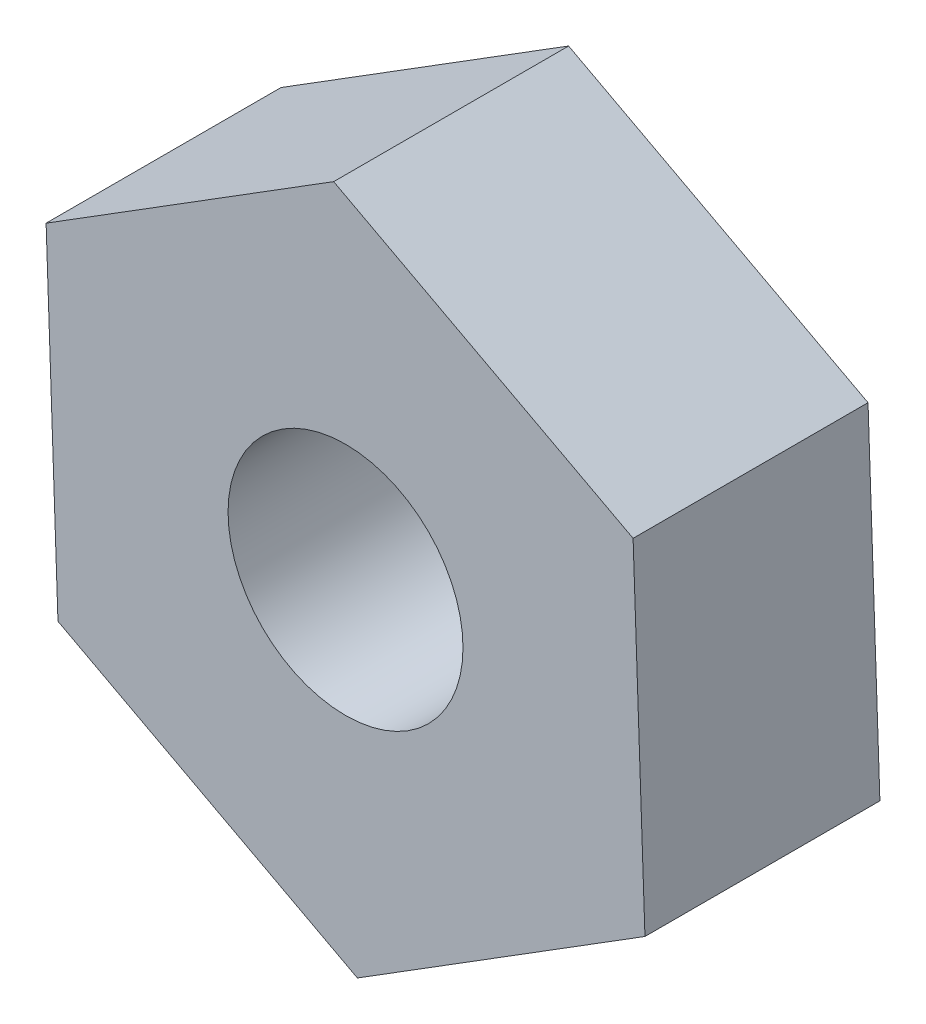
ISO-10303-21;
HEADER;
FILE_DESCRIPTION(('STEP AP214'),'2;1');
FILE_NAME('part.step','',(''),(''),'','','');
FILE_SCHEMA(('AUTOMOTIVE_DESIGN { 1 0 10303 214 1 1 1 1 }'));
ENDSEC;
DATA;
#1=APPLICATION_CONTEXT('core data for automotive mechanical design processes');
#2=APPLICATION_PROTOCOL_DEFINITION('international standard','automotive_design',2000,#1);
#3=PRODUCT_CONTEXT('',#1,'mechanical');
#4=PRODUCT('Part','Part','',(#3));
#5=PRODUCT_RELATED_PRODUCT_CATEGORY('part','',(#4));
#6=PRODUCT_DEFINITION_FORMATION('','',#4);
#7=PRODUCT_DEFINITION_CONTEXT('part definition',#1,'design');
#8=PRODUCT_DEFINITION('design','',#6,#7);
#9=PRODUCT_DEFINITION_SHAPE('','',#8);
#10=(LENGTH_UNIT() NAMED_UNIT(*) SI_UNIT(.MILLI.,.METRE.));
#11=(NAMED_UNIT(*) PLANE_ANGLE_UNIT() SI_UNIT($,.RADIAN.));
#12=(NAMED_UNIT(*) SI_UNIT($,.STERADIAN.) SOLID_ANGLE_UNIT());
#13=UNCERTAINTY_MEASURE_WITH_UNIT(LENGTH_MEASURE(1.E-05),#10,'distance_accuracy_value','');
#14=(GEOMETRIC_REPRESENTATION_CONTEXT(3) GLOBAL_UNCERTAINTY_ASSIGNED_CONTEXT((#13)) GLOBAL_UNIT_ASSIGNED_CONTEXT((#10,
#11,#12)) REPRESENTATION_CONTEXT('',''));
#15=CARTESIAN_POINT('',(0.,0.,0.));
#16=DIRECTION('',(0.,0.,1.));
#17=DIRECTION('',(1.,0.,0.));
#18=AXIS2_PLACEMENT_3D('',#15,#16,#17);
#19=CARTESIAN_POINT('',(0.,0.,2.));
#20=DIRECTION('',(0.,0.,1.));
#21=DIRECTION('',(1.,0.,0.));
#22=AXIS2_PLACEMENT_3D('',#19,#20,#21);
#23=PLANE('',#22);
#24=DIRECTION('',(-0.0349970512423811,0.999387415572329,0.));
#25=VECTOR('',#24,1.);
#26=CARTESIAN_POINT('',(2.5489824313199,-1.35499885540757,2.));
#27=LINE('',#26,#25);
#28=CARTESIAN_POINT('',(2.5489824313199,-1.35499885540757,2.));
#29=VERTEX_POINT('',#28);
#30=CARTESIAN_POINT('',(2.44795464654174,1.52998411161947,2.));
#31=VERTEX_POINT('',#30);
#32=EDGE_CURVE('E132',#29,#31,#27,.T.);
#33=ORIENTED_EDGE('',*,*,#32,.T.);
#34=DIRECTION('',(-0.882993415729303,0.469385372352717,0.));
#35=VECTOR('',#34,1.);
#36=CARTESIAN_POINT('',(2.44795464654174,1.52998411161947,2.));
#37=LINE('',#36,#35);
#38=CARTESIAN_POINT('',(-0.101027784778159,2.88498296702704,2.));
#39=VERTEX_POINT('',#38);
#40=EDGE_CURVE('E90',#31,#39,#37,.T.);
#41=ORIENTED_EDGE('',*,*,#40,.T.);
#42=DIRECTION('',(-0.847996364486922,-0.530002043219612,0.));
#43=VECTOR('',#42,1.);
#44=CARTESIAN_POINT('',(-0.101027784778159,2.88498296702704,2.));
#45=LINE('',#44,#43);
#46=CARTESIAN_POINT('',(-2.5489824313199,1.35499885540757,2.));
#47=VERTEX_POINT('',#46);
#48=EDGE_CURVE('E103',#39,#47,#45,.T.);
#49=ORIENTED_EDGE('',*,*,#48,.T.);
#50=DIRECTION('',(0.0349970512423812,-0.999387415572329,0.));
#51=VECTOR('',#50,1.);
#52=CARTESIAN_POINT('',(-2.5489824313199,1.35499885540757,2.));
#53=LINE('',#52,#51);
#54=CARTESIAN_POINT('',(-2.44795464654174,-1.52998411161947,2.));
#55=VERTEX_POINT('',#54);
#56=EDGE_CURVE('E97',#47,#55,#53,.T.);
#57=ORIENTED_EDGE('',*,*,#56,.T.);
#58=DIRECTION('',(0.882993415729303,-0.469385372352717,0.));
#59=VECTOR('',#58,1.);
#60=CARTESIAN_POINT('',(-2.44795464654174,-1.52998411161947,2.));
#61=LINE('',#60,#59);
#62=CARTESIAN_POINT('',(0.101027784778159,-2.88498296702704,2.));
#63=VERTEX_POINT('',#62);
#64=EDGE_CURVE('E101',#55,#63,#61,.T.);
#65=ORIENTED_EDGE('',*,*,#64,.T.);
#66=DIRECTION('',(0.847996364486922,0.530002043219612,0.));
#67=VECTOR('',#66,1.);
#68=CARTESIAN_POINT('',(0.101027784778159,-2.88498296702704,2.));
#69=LINE('',#68,#67);
#70=EDGE_CURVE('E53',#63,#29,#69,.T.);
#71=ORIENTED_EDGE('',*,*,#70,.T.);
#72=EDGE_LOOP('',(#33,#41,#49,#57,#65,#71));
#73=FACE_BOUND('',#72,.T.);
#74=CARTESIAN_POINT('',(0.,0.,2.));
#75=DIRECTION('',(0.,0.,1.));
#76=DIRECTION('',(1.,0.,0.));
#77=AXIS2_PLACEMENT_3D('',#74,#75,#76);
#78=CIRCLE('',#77,1.);
#79=CARTESIAN_POINT('',(1.,0.,2.));
#80=VERTEX_POINT('',#79);
#81=EDGE_CURVE('E125',#80,#80,#78,.T.);
#82=ORIENTED_EDGE('',*,*,#81,.F.);
#83=EDGE_LOOP('',(#82));
#84=FACE_BOUND('',#83,.T.);
#85=ADVANCED_FACE('F36',(#73,#84),#23,.T.);
#86=CARTESIAN_POINT('',(0.,0.,0.));
#87=DIRECTION('',(0.,0.,1.));
#88=DIRECTION('',(1.,0.,0.));
#89=AXIS2_PLACEMENT_3D('',#86,#87,#88);
#90=PLANE('',#89);
#91=DIRECTION('',(-0.0349970512423811,0.999387415572329,0.));
#92=VECTOR('',#91,1.);
#93=CARTESIAN_POINT('',(2.5489824313199,-1.35499885540757,0.));
#94=LINE('',#93,#92);
#95=CARTESIAN_POINT('',(2.5489824313199,-1.35499885540757,0.));
#96=VERTEX_POINT('',#95);
#97=CARTESIAN_POINT('',(2.44795464654174,1.52998411161947,0.));
#98=VERTEX_POINT('',#97);
#99=EDGE_CURVE('E121',#96,#98,#94,.T.);
#100=ORIENTED_EDGE('',*,*,#99,.F.);
#101=DIRECTION('',(0.847996364486922,0.530002043219612,0.));
#102=VECTOR('',#101,1.);
#103=CARTESIAN_POINT('',(0.101027784778159,-2.88498296702704,0.));
#104=LINE('',#103,#102);
#105=CARTESIAN_POINT('',(0.101027784778159,-2.88498296702704,0.));
#106=VERTEX_POINT('',#105);
#107=EDGE_CURVE('E82',#106,#96,#104,.T.);
#108=ORIENTED_EDGE('',*,*,#107,.F.);
#109=DIRECTION('',(0.882993415729303,-0.469385372352717,0.));
#110=VECTOR('',#109,1.);
#111=CARTESIAN_POINT('',(-2.44795464654174,-1.52998411161947,0.));
#112=LINE('',#111,#110);
#113=CARTESIAN_POINT('',(-2.44795464654174,-1.52998411161947,0.));
#114=VERTEX_POINT('',#113);
#115=EDGE_CURVE('E76',#114,#106,#112,.T.);
#116=ORIENTED_EDGE('',*,*,#115,.F.);
#117=DIRECTION('',(0.0349970512423812,-0.999387415572329,0.));
#118=VECTOR('',#117,1.);
#119=CARTESIAN_POINT('',(-2.5489824313199,1.35499885540757,0.));
#120=LINE('',#119,#118);
#121=CARTESIAN_POINT('',(-2.5489824313199,1.35499885540757,0.));
#122=VERTEX_POINT('',#121);
#123=EDGE_CURVE('E111',#122,#114,#120,.T.);
#124=ORIENTED_EDGE('',*,*,#123,.F.);
#125=DIRECTION('',(-0.847996364486922,-0.530002043219612,0.));
#126=VECTOR('',#125,1.);
#127=CARTESIAN_POINT('',(-0.101027784778159,2.88498296702704,0.));
#128=LINE('',#127,#126);
#129=CARTESIAN_POINT('',(-0.101027784778159,2.88498296702704,0.));
#130=VERTEX_POINT('',#129);
#131=EDGE_CURVE('E127',#130,#122,#128,.T.);
#132=ORIENTED_EDGE('',*,*,#131,.F.);
#133=DIRECTION('',(-0.882993415729303,0.469385372352717,0.));
#134=VECTOR('',#133,1.);
#135=CARTESIAN_POINT('',(2.44795464654174,1.52998411161947,0.));
#136=LINE('',#135,#134);
#137=EDGE_CURVE('E124',#98,#130,#136,.T.);
#138=ORIENTED_EDGE('',*,*,#137,.F.);
#139=EDGE_LOOP('',(#100,#108,#116,#124,#132,#138));
#140=FACE_BOUND('',#139,.T.);
#141=CARTESIAN_POINT('',(0.,0.,0.));
#142=DIRECTION('',(0.,0.,1.));
#143=DIRECTION('',(1.,0.,0.));
#144=AXIS2_PLACEMENT_3D('',#141,#142,#143);
#145=CIRCLE('',#144,1.);
#146=CARTESIAN_POINT('',(1.,0.,0.));
#147=VERTEX_POINT('',#146);
#148=EDGE_CURVE('E227',#147,#147,#145,.T.);
#149=ORIENTED_EDGE('',*,*,#148,.T.);
#150=EDGE_LOOP('',(#149));
#151=FACE_BOUND('',#150,.T.);
#152=ADVANCED_FACE('F141',(#140,#151),#90,.F.);
#153=CARTESIAN_POINT('',(2.5489824313199,-1.35499885540757,2.));
#154=DIRECTION('',(-0.999387415572329,-0.0349970512423811,0.));
#155=DIRECTION('',(0.0349970512423811,-0.999387415572329,0.));
#156=AXIS2_PLACEMENT_3D('',#153,#154,#155);
#157=PLANE('',#156);
#158=ORIENTED_EDGE('',*,*,#99,.T.);
#159=DIRECTION('',(0.,0.,-1.));
#160=VECTOR('',#159,1.);
#161=CARTESIAN_POINT('',(2.44795464654174,1.52998411161947,2.));
#162=LINE('',#161,#160);
#163=EDGE_CURVE('E11',#31,#98,#162,.T.);
#164=ORIENTED_EDGE('',*,*,#163,.F.);
#165=ORIENTED_EDGE('',*,*,#32,.F.);
#166=DIRECTION('',(0.,0.,-1.));
#167=VECTOR('',#166,1.);
#168=CARTESIAN_POINT('',(2.5489824313199,-1.35499885540757,2.));
#169=LINE('',#168,#167);
#170=EDGE_CURVE('E117',#29,#96,#169,.T.);
#171=ORIENTED_EDGE('',*,*,#170,.T.);
#172=EDGE_LOOP('',(#158,#164,#165,#171));
#173=FACE_BOUND('',#172,.T.);
#174=ADVANCED_FACE('F38',(#173),#157,.F.);
#175=CARTESIAN_POINT('',(2.44795464654174,1.52998411161947,2.));
#176=DIRECTION('',(-0.469385372352717,-0.882993415729303,0.));
#177=DIRECTION('',(0.882993415729303,-0.469385372352717,0.));
#178=AXIS2_PLACEMENT_3D('',#175,#176,#177);
#179=PLANE('',#178);
#180=ORIENTED_EDGE('',*,*,#137,.T.);
#181=DIRECTION('',(0.,0.,-1.));
#182=VECTOR('',#181,1.);
#183=CARTESIAN_POINT('',(-0.101027784778159,2.88498296702704,2.));
#184=LINE('',#183,#182);
#185=EDGE_CURVE('E45',#39,#130,#184,.T.);
#186=ORIENTED_EDGE('',*,*,#185,.F.);
#187=ORIENTED_EDGE('',*,*,#40,.F.);
#188=ORIENTED_EDGE('',*,*,#163,.T.);
#189=EDGE_LOOP('',(#180,#186,#187,#188));
#190=FACE_BOUND('',#189,.T.);
#191=ADVANCED_FACE('F166',(#190),#179,.F.);
#192=CARTESIAN_POINT('',(-0.101027784778159,2.88498296702704,2.));
#193=DIRECTION('',(0.530002043219612,-0.847996364486922,0.));
#194=DIRECTION('',(0.847996364486922,0.530002043219612,0.));
#195=AXIS2_PLACEMENT_3D('',#192,#193,#194);
#196=PLANE('',#195);
#197=ORIENTED_EDGE('',*,*,#131,.T.);
#198=DIRECTION('',(0.,0.,-1.));
#199=VECTOR('',#198,1.);
#200=CARTESIAN_POINT('',(-2.5489824313199,1.35499885540757,2.));
#201=LINE('',#200,#199);
#202=EDGE_CURVE('E112',#47,#122,#201,.T.);
#203=ORIENTED_EDGE('',*,*,#202,.F.);
#204=ORIENTED_EDGE('',*,*,#48,.F.);
#205=ORIENTED_EDGE('',*,*,#185,.T.);
#206=EDGE_LOOP('',(#197,#203,#204,#205));
#207=FACE_BOUND('',#206,.T.);
#208=ADVANCED_FACE('F138',(#207),#196,.F.);
#209=CARTESIAN_POINT('',(-2.5489824313199,1.35499885540757,2.));
#210=DIRECTION('',(0.999387415572329,0.0349970512423812,0.));
#211=DIRECTION('',(-0.0349970512423812,0.999387415572329,0.));
#212=AXIS2_PLACEMENT_3D('',#209,#210,#211);
#213=PLANE('',#212);
#214=ORIENTED_EDGE('',*,*,#123,.T.);
#215=DIRECTION('',(0.,0.,-1.));
#216=VECTOR('',#215,1.);
#217=CARTESIAN_POINT('',(-2.44795464654174,-1.52998411161947,2.));
#218=LINE('',#217,#216);
#219=EDGE_CURVE('E108',#55,#114,#218,.T.);
#220=ORIENTED_EDGE('',*,*,#219,.F.);
#221=ORIENTED_EDGE('',*,*,#56,.F.);
#222=ORIENTED_EDGE('',*,*,#202,.T.);
#223=EDGE_LOOP('',(#214,#220,#221,#222));
#224=FACE_BOUND('',#223,.T.);
#225=ADVANCED_FACE('F109',(#224),#213,.F.);
#226=CARTESIAN_POINT('',(-2.44795464654174,-1.52998411161947,2.));
#227=DIRECTION('',(0.469385372352717,0.882993415729303,0.));
#228=DIRECTION('',(-0.882993415729303,0.469385372352717,0.));
#229=AXIS2_PLACEMENT_3D('',#226,#227,#228);
#230=PLANE('',#229);
#231=ORIENTED_EDGE('',*,*,#115,.T.);
#232=DIRECTION('',(0.,0.,-1.));
#233=VECTOR('',#232,1.);
#234=CARTESIAN_POINT('',(0.101027784778159,-2.88498296702704,2.));
#235=LINE('',#234,#233);
#236=EDGE_CURVE('E113',#63,#106,#235,.T.);
#237=ORIENTED_EDGE('',*,*,#236,.F.);
#238=ORIENTED_EDGE('',*,*,#64,.F.);
#239=ORIENTED_EDGE('',*,*,#219,.T.);
#240=EDGE_LOOP('',(#231,#237,#238,#239));
#241=FACE_BOUND('',#240,.T.);
#242=ADVANCED_FACE('F115',(#241),#230,.F.);
#243=CARTESIAN_POINT('',(0.101027784778159,-2.88498296702704,2.));
#244=DIRECTION('',(-0.530002043219612,0.847996364486922,0.));
#245=DIRECTION('',(-0.847996364486922,-0.530002043219612,0.));
#246=AXIS2_PLACEMENT_3D('',#243,#244,#245);
#247=PLANE('',#246);
#248=ORIENTED_EDGE('',*,*,#107,.T.);
#249=ORIENTED_EDGE('',*,*,#170,.F.);
#250=ORIENTED_EDGE('',*,*,#70,.F.);
#251=ORIENTED_EDGE('',*,*,#236,.T.);
#252=EDGE_LOOP('',(#248,#249,#250,#251));
#253=FACE_BOUND('',#252,.T.);
#254=ADVANCED_FACE('F146',(#253),#247,.F.);
#255=CARTESIAN_POINT('',(0.,0.,2.));
#256=DIRECTION('',(0.,0.,-1.));
#257=DIRECTION('',(-1.,0.,0.));
#258=AXIS2_PLACEMENT_3D('',#255,#256,#257);
#259=CYLINDRICAL_SURFACE('',#258,1.);
#260=ORIENTED_EDGE('',*,*,#81,.T.);
#261=EDGE_LOOP('',(#260));
#262=FACE_BOUND('',#261,.T.);
#263=ORIENTED_EDGE('',*,*,#148,.F.);
#264=EDGE_LOOP('',(#263));
#265=FACE_BOUND('',#264,.T.);
#266=ADVANCED_FACE('F148',(#262,#265),#259,.F.);
#267=CLOSED_SHELL('',(#85,#152,#174,#191,#208,#225,#242,#254,#266));
#268=MANIFOLD_SOLID_BREP('B2',#267);
#269=ADVANCED_BREP_SHAPE_REPRESENTATION('',(#18,#268),#14);
#270=SHAPE_DEFINITION_REPRESENTATION(#9,#269);
ENDSEC;
END-ISO-10303-21;
